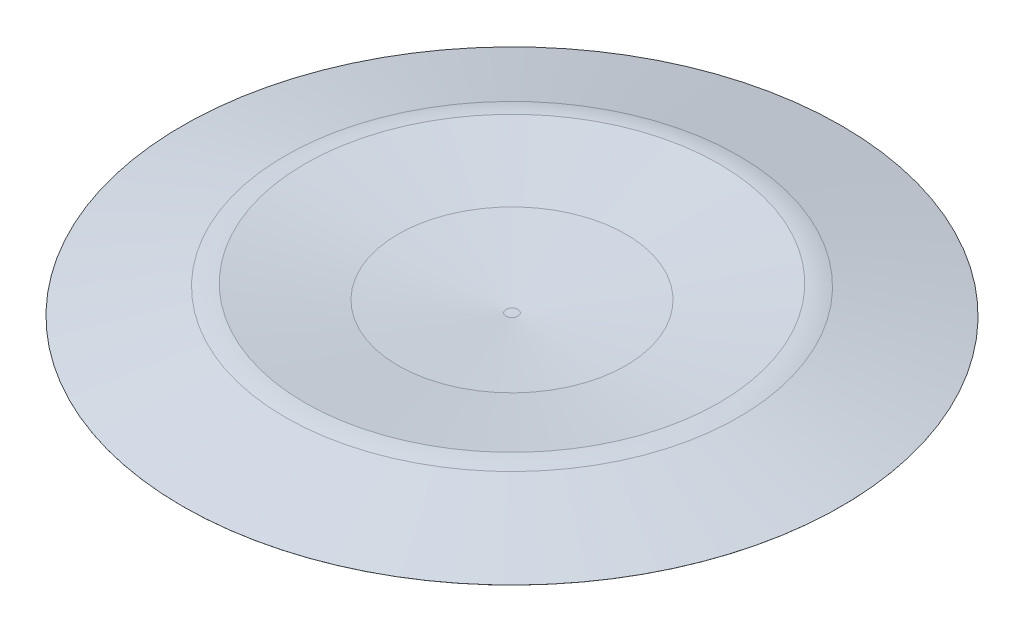
ISO-10303-21;
HEADER;
FILE_DESCRIPTION(('STEP AP214'),'2;1');
FILE_NAME('part.step','',(''),(''),'','','');
FILE_SCHEMA(('AUTOMOTIVE_DESIGN { 1 0 10303 214 1 1 1 1 }'));
ENDSEC;
DATA;
#1=APPLICATION_CONTEXT('core data for automotive mechanical design processes');
#2=APPLICATION_PROTOCOL_DEFINITION('international standard','automotive_design',2000,#1);
#3=PRODUCT_CONTEXT('',#1,'mechanical');
#4=PRODUCT('Part','Part','',(#3));
#5=PRODUCT_RELATED_PRODUCT_CATEGORY('part','',(#4));
#6=PRODUCT_DEFINITION_FORMATION('','',#4);
#7=PRODUCT_DEFINITION_CONTEXT('part definition',#1,'design');
#8=PRODUCT_DEFINITION('design','',#6,#7);
#9=PRODUCT_DEFINITION_SHAPE('','',#8);
#10=(LENGTH_UNIT() NAMED_UNIT(*) SI_UNIT(.MILLI.,.METRE.));
#11=(NAMED_UNIT(*) PLANE_ANGLE_UNIT() SI_UNIT($,.RADIAN.));
#12=(NAMED_UNIT(*) SI_UNIT($,.STERADIAN.) SOLID_ANGLE_UNIT());
#13=UNCERTAINTY_MEASURE_WITH_UNIT(LENGTH_MEASURE(1.E-05),#10,'distance_accuracy_value','');
#14=(GEOMETRIC_REPRESENTATION_CONTEXT(3) GLOBAL_UNCERTAINTY_ASSIGNED_CONTEXT((#13)) GLOBAL_UNIT_ASSIGNED_CONTEXT((#10,
#11,#12)) REPRESENTATION_CONTEXT('',''));
#15=CARTESIAN_POINT('',(0.,0.,0.));
#16=DIRECTION('',(0.,0.,1.));
#17=DIRECTION('',(1.,0.,0.));
#18=AXIS2_PLACEMENT_3D('',#15,#16,#17);
#19=CARTESIAN_POINT('',(-4.84248431704501,544.755446128668,0.));
#20=DIRECTION('',(0.,1.,0.));
#21=DIRECTION('',(0.,0.,1.));
#22=AXIS2_PLACEMENT_3D('',#19,#20,#21);
#23=CONICAL_SURFACE('',#22,559.536973656049,0.243308138618988);
#24=CARTESIAN_POINT('',(-4.84248431704501,544.852500759468,0.));
#25=DIRECTION('',(0.,-1.,0.));
#26=DIRECTION('',(0.,0.,-1.));
#27=AXIS2_PLACEMENT_3D('',#24,#25,#26);
#28=CIRCLE('',#27,559.561065120104);
#29=CARTESIAN_POINT('',(-4.84248431704501,544.852500759468,-559.561065120104));
#30=VERTEX_POINT('',#29);
#31=EDGE_CURVE('E10',#30,#30,#28,.T.);
#32=ORIENTED_EDGE('',*,*,#31,.T.);
#33=EDGE_LOOP('',(#32));
#34=FACE_BOUND('',#33,.T.);
#35=CARTESIAN_POINT('',(-4.84248431704501,544.755446128668,0.));
#36=DIRECTION('',(0.,-1.,0.));
#37=DIRECTION('',(0.,0.,-1.));
#38=AXIS2_PLACEMENT_3D('',#35,#36,#37);
#39=CIRCLE('',#38,559.536973656049);
#40=CARTESIAN_POINT('',(-4.84248431704501,544.755446128668,-559.536973656049));
#41=VERTEX_POINT('',#40);
#42=EDGE_CURVE('E65',#41,#41,#39,.T.);
#43=ORIENTED_EDGE('',*,*,#42,.F.);
#44=EDGE_LOOP('',(#43));
#45=FACE_BOUND('',#44,.T.);
#46=ADVANCED_FACE('F31',(#34,#45),#23,.T.);
#47=CARTESIAN_POINT('',(-4.84248431704501,544.852500759468,0.));
#48=DIRECTION('',(0.,-1.,0.));
#49=DIRECTION('',(0.,0.,-1.));
#50=AXIS2_PLACEMENT_3D('',#47,#48,#49);
#51=CONICAL_SURFACE('',#50,559.561065120104,1.32748818817591);
#52=CARTESIAN_POINT('',(-4.84248431704501,588.217230765257,0.));
#53=DIRECTION('',(0.,-1.,0.));
#54=DIRECTION('',(0.,0.,-1.));
#55=AXIS2_PLACEMENT_3D('',#52,#53,#54);
#56=CIRCLE('',#55,384.862348146623);
#57=CARTESIAN_POINT('',(-4.84248431704501,588.217230765257,-384.862348146623));
#58=VERTEX_POINT('',#57);
#59=EDGE_CURVE('E37',#58,#58,#56,.T.);
#60=ORIENTED_EDGE('',*,*,#59,.T.);
#61=EDGE_LOOP('',(#60));
#62=FACE_BOUND('',#61,.T.);
#63=ORIENTED_EDGE('',*,*,#31,.F.);
#64=EDGE_LOOP('',(#63));
#65=FACE_BOUND('',#64,.T.);
#66=ADVANCED_FACE('F73',(#62,#65),#51,.T.);
#67=CARTESIAN_POINT('',(-4.84248431704504,440.820618816827,0.));
#68=DIRECTION('',(0.,-1.,0.));
#69=DIRECTION('',(0.,0.,-1.));
#70=AXIS2_PLACEMENT_3D('',#67,#68,#69);
#71=TOROIDAL_SURFACE('',#70,347.33037795954,152.1);
#72=CARTESIAN_POINT('',(-4.84248431704501,592.862620368192,0.));
#73=DIRECTION('',(0.,-1.,0.));
#74=DIRECTION('',(0.,0.,-1.));
#75=AXIS2_PLACEMENT_3D('',#72,#73,#74);
#76=CIRCLE('',#75,351.530349894534);
#77=CARTESIAN_POINT('',(-4.84248431704501,592.862620368192,-351.530349894534));
#78=VERTEX_POINT('',#77);
#79=EDGE_CURVE('E41',#78,#78,#76,.T.);
#80=ORIENTED_EDGE('',*,*,#79,.T.);
#81=EDGE_LOOP('',(#80));
#82=FACE_BOUND('',#81,.T.);
#83=ORIENTED_EDGE('',*,*,#59,.F.);
#84=EDGE_LOOP('',(#83));
#85=FACE_BOUND('',#84,.T.);
#86=ADVANCED_FACE('F77',(#82,#85),#71,.T.);
#87=CARTESIAN_POINT('',(-4.84248431704501,592.862620368192,0.));
#88=DIRECTION('',(0.,1.,0.));
#89=DIRECTION('',(0.,0.,1.));
#90=AXIS2_PLACEMENT_3D('',#87,#88,#89);
#91=CONICAL_SURFACE('',#90,351.530349894534,1.41797592265982);
#92=CARTESIAN_POINT('',(-4.84248431704501,568.505419815115,0.));
#93=DIRECTION('',(0.,-1.,0.));
#94=DIRECTION('',(0.,0.,-1.));
#95=AXIS2_PLACEMENT_3D('',#92,#93,#94);
#96=CIRCLE('',#95,193.388565675141);
#97=CARTESIAN_POINT('',(-4.84248431704501,568.505419815115,193.388565675142));
#98=VERTEX_POINT('',#97);
#99=EDGE_CURVE('E45',#98,#98,#96,.T.);
#100=ORIENTED_EDGE('',*,*,#99,.T.);
#101=EDGE_LOOP('',(#100));
#102=FACE_BOUND('',#101,.T.);
#103=ORIENTED_EDGE('',*,*,#79,.F.);
#104=EDGE_LOOP('',(#103));
#105=FACE_BOUND('',#104,.T.);
#106=ADVANCED_FACE('F81',(#102,#105),#91,.F.);
#107=CARTESIAN_POINT('',(-4.84248431704501,568.505419815115,0.));
#108=DIRECTION('',(0.,1.,0.));
#109=DIRECTION('',(0.,0.,1.));
#110=AXIS2_PLACEMENT_3D('',#107,#108,#109);
#111=CONICAL_SURFACE('',#110,193.388565675141,1.46785561534456);
#112=CARTESIAN_POINT('',(-4.84248431704501,549.558479610497,0.));
#113=DIRECTION('',(0.,-1.,0.));
#114=DIRECTION('',(0.,0.,-1.));
#115=AXIS2_PLACEMENT_3D('',#112,#113,#114);
#116=CIRCLE('',#115,9.98234059215341);
#117=CARTESIAN_POINT('',(-4.84248431704501,549.558479610497,9.98234059215394));
#118=VERTEX_POINT('',#117);
#119=EDGE_CURVE('E50',#118,#118,#116,.T.);
#120=CARTESIAN_POINT('',(-4.84248431704501,549.558479610497,9.98234059215394));
#121=CARTESIAN_POINT('',(-4.84248431704501,549.755843570962,11.8928221034351));
#122=CARTESIAN_POINT('',(-4.84248431704501,549.953207531427,13.8033036147162));
#123=CARTESIAN_POINT('',(-4.84248431704501,550.347935452356,17.6242666372784));
#124=CARTESIAN_POINT('',(-4.84248431704501,550.545299412821,19.5347481485596));
#125=CARTESIAN_POINT('',(-4.84248431704501,550.940027333751,23.3557111711218));
#126=CARTESIAN_POINT('',(-4.84248431704501,551.137391294215,25.2661926824029));
#127=CARTESIAN_POINT('',(-4.84248431704501,551.532119215145,29.0871557049652));
#128=CARTESIAN_POINT('',(-4.84248431704501,551.72948317561,30.9976372162463));
#129=CARTESIAN_POINT('',(-4.84248431704501,552.124211096539,34.8186002388085));
#130=CARTESIAN_POINT('',(-4.84248431704501,552.321575057004,36.7290817500897));
#131=CARTESIAN_POINT('',(-4.84248431704501,552.716302977934,40.5500447726519));
#132=CARTESIAN_POINT('',(-4.84248431704501,552.913666938398,42.460526283933));
#133=CARTESIAN_POINT('',(-4.84248431704501,553.308394859328,46.2814893064953));
#134=CARTESIAN_POINT('',(-4.84248431704501,553.505758819793,48.1919708177764));
#135=CARTESIAN_POINT('',(-4.84248431704501,553.900486740722,52.0129338403387));
#136=CARTESIAN_POINT('',(-4.84248431704501,554.097850701187,53.9234153516198));
#137=CARTESIAN_POINT('',(-4.84248431704501,554.492578622117,57.744378374182));
#138=CARTESIAN_POINT('',(-4.84248431704501,554.689942582581,59.6548598854632));
#139=CARTESIAN_POINT('',(-4.84248431704501,555.084670503511,63.4758229080254));
#140=CARTESIAN_POINT('',(-4.84248431704501,555.282034463975,65.3863044193065));
#141=CARTESIAN_POINT('',(-4.84248431704501,555.676762384905,69.2072674418688));
#142=CARTESIAN_POINT('',(-4.84248431704501,555.87412634537,71.1177489531499));
#143=CARTESIAN_POINT('',(-4.84248431704501,556.268854266299,74.9387119757121));
#144=CARTESIAN_POINT('',(-4.84248431704501,556.466218226764,76.8491934869933));
#145=CARTESIAN_POINT('',(-4.84248431704501,556.860946147694,80.6701565095555));
#146=CARTESIAN_POINT('',(-4.84248431704501,557.058310108158,82.5806380208366));
#147=CARTESIAN_POINT('',(-4.84248431704501,557.453038029088,86.4016010433989));
#148=CARTESIAN_POINT('',(-4.84248431704501,557.650401989553,88.31208255468));
#149=CARTESIAN_POINT('',(-4.84248431704501,558.045129910482,92.1330455772423));
#150=CARTESIAN_POINT('',(-4.84248431704501,558.242493870947,94.0435270885234));
#151=CARTESIAN_POINT('',(-4.84248431704501,558.637221791877,97.8644901110856));
#152=CARTESIAN_POINT('',(-4.84248431704501,558.834585752341,99.7749716223668));
#153=CARTESIAN_POINT('',(-4.84248431704501,559.229313673271,103.595934644929));
#154=CARTESIAN_POINT('',(-4.84248431704501,559.426677633735,105.50641615621));
#155=CARTESIAN_POINT('',(-4.84248431704501,559.821405554665,109.327379178772));
#156=CARTESIAN_POINT('',(-4.84248431704501,560.01876951513,111.237860690054));
#157=CARTESIAN_POINT('',(-4.84248431704501,560.413497436059,115.058823712616));
#158=CARTESIAN_POINT('',(-4.84248431704501,560.610861396524,116.969305223897));
#159=CARTESIAN_POINT('',(-4.84248431704501,561.005589317454,120.790268246459));
#160=CARTESIAN_POINT('',(-4.84248431704501,561.202953277918,122.70074975774));
#161=CARTESIAN_POINT('',(-4.84248431704501,561.597681198848,126.521712780302));
#162=CARTESIAN_POINT('',(-4.84248431704501,561.795045159313,128.432194291584));
#163=CARTESIAN_POINT('',(-4.84248431704501,562.189773080242,132.253157314146));
#164=CARTESIAN_POINT('',(-4.84248431704501,562.387137040707,134.163638825427));
#165=CARTESIAN_POINT('',(-4.84248431704501,562.781864961637,137.984601847989));
#166=CARTESIAN_POINT('',(-4.84248431704501,562.979228922101,139.89508335927));
#167=CARTESIAN_POINT('',(-4.84248431704501,563.373956843031,143.716046381833));
#168=CARTESIAN_POINT('',(-4.84248431704501,563.571320803496,145.626527893114));
#169=CARTESIAN_POINT('',(-4.84248431704501,563.966048724425,149.447490915676));
#170=CARTESIAN_POINT('',(-4.84248431704501,564.16341268489,151.357972426957));
#171=CARTESIAN_POINT('',(-4.84248431704501,564.558140605819,155.178935449519));
#172=CARTESIAN_POINT('',(-4.84248431704501,564.755504566284,157.0894169608));
#173=CARTESIAN_POINT('',(-4.84248431704501,565.150232487214,160.910379983363));
#174=CARTESIAN_POINT('',(-4.84248431704501,565.347596447678,162.820861494644));
#175=CARTESIAN_POINT('',(-4.84248431704501,565.742324368608,166.641824517206));
#176=CARTESIAN_POINT('',(-4.84248431704501,565.939688329073,168.552306028487));
#177=CARTESIAN_POINT('',(-4.84248431704501,566.334416250002,172.373269051049));
#178=CARTESIAN_POINT('',(-4.84248431704501,566.531780210467,174.283750562331));
#179=CARTESIAN_POINT('',(-4.84248431704501,566.926508131397,178.104713584893));
#180=CARTESIAN_POINT('',(-4.84248431704501,567.123872091861,180.015195096174));
#181=CARTESIAN_POINT('',(-4.84248431704501,567.518600012791,183.836158118736));
#182=CARTESIAN_POINT('',(-4.84248431704501,567.715963973256,185.746639630017));
#183=CARTESIAN_POINT('',(-4.84248431704501,568.110691894185,189.56760265258));
#184=CARTESIAN_POINT('',(-4.84248431704501,568.30805585465,191.478084163861));
#185=CARTESIAN_POINT('',(-4.84248431704501,568.505419815115,193.388565675142));
#186=B_SPLINE_CURVE_WITH_KNOTS('',3,(#120,#121,#122,#123,#124,#125,#126,#127,#128,#129,#130,
#131,#132,#133,#134,#135,#136,#137,#138,#139,#140,#141,#142,#143,#144,#145,#146,#147,#148,#149,
#150,#151,#152,#153,#154,#155,#156,#157,#158,#159,#160,#161,#162,#163,#164,#165,#166,#167,#168,
#169,#170,#171,#172,#173,#174,#175,#176,#177,#178,#179,#180,#181,#182,#183,#184,#185),
.UNSPECIFIED.,.F.,.F.,(4,2,2,2,2,2,2,2,2,2,2,2,2,2,2,2,2,2,2,2,2,2,2,2,2,2,2,2,2,2,2,2,4),(0.,
5.76194665373917,11.5238933074784,17.2858399612175,23.0477866149567,28.8097332686959,
34.5716799224351,40.3336265761743,46.0955732299134,51.8575198836526,57.6194665373918,
63.3814131911309,69.1433598448701,74.9053064986093,80.6672531523485,86.4291998060876,
92.1911464598268,97.953093113566,103.715039767305,109.476986421044,115.238933074784,
121.000879728523,126.762826382262,132.524773036001,138.28671968974,144.048666343479,
149.810612997219,155.572559650958,161.334506304697,167.096452958436,172.858399612175,
178.620346265914,184.382292919654),.UNSPECIFIED.);
#187=EDGE_CURVE('BSEAM88',#118,#98,#186,.T.);
#188=ORIENTED_EDGE('',*,*,#119,.T.);
#189=ORIENTED_EDGE('',*,*,#99,.F.);
#190=ORIENTED_EDGE('',*,*,#187,.T.);
#191=ORIENTED_EDGE('',*,*,#187,.F.);
#192=EDGE_LOOP('',(#188,#190,#189,#191));
#193=FACE_BOUND('',#192,.T.);
#194=ADVANCED_FACE('F88',(#193),#111,.F.);
#195=CARTESIAN_POINT('',(5.1398562751084,549.558479610497,0.));
#196=DIRECTION('',(0.,1.,0.));
#197=DIRECTION('',(0.,0.,1.));
#198=AXIS2_PLACEMENT_3D('',#195,#196,#197);
#199=PLANE('',#198);
#200=ORIENTED_EDGE('',*,*,#119,.F.);
#201=EDGE_LOOP('',(#200));
#202=FACE_BOUND('',#201,.T.);
#203=ADVANCED_FACE('F92',(#202),#199,.T.);
#204=CARTESIAN_POINT('',(5.14500786067405,549.458479610497,0.));
#205=DIRECTION('',(0.,-1.,0.));
#206=DIRECTION('',(0.,0.,-1.));
#207=AXIS2_PLACEMENT_3D('',#204,#205,#206);
#208=PLANE('',#207);
#209=CARTESIAN_POINT('',(-4.84248431704501,549.458479610497,0.));
#210=DIRECTION('',(0.,-1.,0.));
#211=DIRECTION('',(0.,0.,-1.));
#212=AXIS2_PLACEMENT_3D('',#209,#210,#211);
#213=CIRCLE('',#212,9.98749217771906);
#214=CARTESIAN_POINT('',(-4.84248431704501,549.458479610497,9.9874921777196));
#215=VERTEX_POINT('',#214);
#216=EDGE_CURVE('E53',#215,#215,#213,.T.);
#217=ORIENTED_EDGE('',*,*,#216,.T.);
#218=EDGE_LOOP('',(#217));
#219=FACE_BOUND('',#218,.T.);
#220=ADVANCED_FACE('F96',(#219),#208,.T.);
#221=CARTESIAN_POINT('',(-4.84248431704501,549.458479610497,0.));
#222=DIRECTION('',(0.,1.,0.));
#223=DIRECTION('',(0.,0.,1.));
#224=AXIS2_PLACEMENT_3D('',#221,#222,#223);
#225=CONICAL_SURFACE('',#224,9.98749217771906,1.46785561534456);
#226=CARTESIAN_POINT('',(-4.84248431704501,568.406205519418,0.));
#227=DIRECTION('',(0.,-1.,0.));
#228=DIRECTION('',(0.,0.,-1.));
#229=AXIS2_PLACEMENT_3D('',#226,#227,#228);
#230=CIRCLE('',#229,193.401322871888);
#231=CARTESIAN_POINT('',(-4.84248431704501,568.406205519418,193.401322871889));
#232=VERTEX_POINT('',#231);
#233=EDGE_CURVE('E56',#232,#232,#230,.T.);
#234=CARTESIAN_POINT('',(-4.84248431704501,568.406205519418,193.401322871889));
#235=CARTESIAN_POINT('',(-4.84248431704501,568.208833374533,191.490762135491));
#236=CARTESIAN_POINT('',(-4.84248431704501,568.011461229649,189.580201399093));
#237=CARTESIAN_POINT('',(-4.84248431704501,567.61671693988,185.759079926298));
#238=CARTESIAN_POINT('',(-4.84248431704501,567.419344794995,183.848519189901));
#239=CARTESIAN_POINT('',(-4.84248431704501,567.024600505226,180.027397717105));
#240=CARTESIAN_POINT('',(-4.84248431704501,566.827228360341,178.116836980708));
#241=CARTESIAN_POINT('',(-4.84248431704501,566.432484070572,174.295715507913));
#242=CARTESIAN_POINT('',(-4.84248431704501,566.235111925687,172.385154771515));
#243=CARTESIAN_POINT('',(-4.84248431704501,565.840367635918,168.56403329872));
#244=CARTESIAN_POINT('',(-4.84248431704501,565.642995491034,166.653472562322));
#245=CARTESIAN_POINT('',(-4.84248431704501,565.248251201265,162.832351089527));
#246=CARTESIAN_POINT('',(-4.84248431704501,565.05087905638,160.921790353129));
#247=CARTESIAN_POINT('',(-4.84248431704501,564.656134766611,157.100668880334));
#248=CARTESIAN_POINT('',(-4.84248431704501,564.458762621726,155.190108143937));
#249=CARTESIAN_POINT('',(-4.84248431704501,564.064018331957,151.368986671142));
#250=CARTESIAN_POINT('',(-4.84248431704501,563.866646187072,149.458425934744));
#251=CARTESIAN_POINT('',(-4.84248431704501,563.471901897303,145.637304461949));
#252=CARTESIAN_POINT('',(-4.84248431704501,563.274529752419,143.726743725551));
#253=CARTESIAN_POINT('',(-4.84248431704501,562.879785462649,139.905622252756));
#254=CARTESIAN_POINT('',(-4.84248431704501,562.682413317765,137.995061516358));
#255=CARTESIAN_POINT('',(-4.84248431704501,562.287669027996,134.173940043563));
#256=CARTESIAN_POINT('',(-4.84248431704501,562.090296883111,132.263379307166));
#257=CARTESIAN_POINT('',(-4.84248431704501,561.695552593342,128.44225783437));
#258=CARTESIAN_POINT('',(-4.84248431704501,561.498180448457,126.531697097973));
#259=CARTESIAN_POINT('',(-4.84248431704501,561.103436158688,122.710575625178));
#260=CARTESIAN_POINT('',(-4.84248431704501,560.906064013804,120.80001488878));
#261=CARTESIAN_POINT('',(-4.84248431704501,560.511319724034,116.978893415985));
#262=CARTESIAN_POINT('',(-4.84248431704501,560.31394757915,115.068332679587));
#263=CARTESIAN_POINT('',(-4.84248431704501,559.919203289381,111.247211206792));
#264=CARTESIAN_POINT('',(-4.84248431704501,559.721831144496,109.336650470394));
#265=CARTESIAN_POINT('',(-4.84248431704501,559.327086854727,105.515528997599));
#266=CARTESIAN_POINT('',(-4.84248431704501,559.129714709842,103.604968261202));
#267=CARTESIAN_POINT('',(-4.84248431704501,558.734970420073,99.7838467884065));
#268=CARTESIAN_POINT('',(-4.84248431704501,558.537598275188,97.8732860520089));
#269=CARTESIAN_POINT('',(-4.84248431704501,558.142853985419,94.0521645792137));
#270=CARTESIAN_POINT('',(-4.84248431704501,557.945481840535,92.1416038428161));
#271=CARTESIAN_POINT('',(-4.84248431704501,557.550737550766,88.320482370021));
#272=CARTESIAN_POINT('',(-4.84248431704501,557.353365405881,86.4099216336234));
#273=CARTESIAN_POINT('',(-4.84248431704501,556.958621116112,82.5888001608282));
#274=CARTESIAN_POINT('',(-4.84248431704501,556.761248971227,80.6782394244306));
#275=CARTESIAN_POINT('',(-4.84248431704501,556.366504681458,76.8571179516354));
#276=CARTESIAN_POINT('',(-4.84248431704501,556.169132536573,74.9465572152378));
#277=CARTESIAN_POINT('',(-4.84248431704501,555.774388246804,71.1254357424426));
#278=CARTESIAN_POINT('',(-4.84248431704501,555.57701610192,69.214875006045));
#279=CARTESIAN_POINT('',(-4.84248431704501,555.18227181215,65.3937535332498));
#280=CARTESIAN_POINT('',(-4.84248431704501,554.984899667266,63.4831927968522));
#281=CARTESIAN_POINT('',(-4.84248431704501,554.590155377497,59.662071324057));
#282=CARTESIAN_POINT('',(-4.84248431704501,554.392783232612,57.7515105876594));
#283=CARTESIAN_POINT('',(-4.84248431704501,553.998038942843,53.9303891148643));
#284=CARTESIAN_POINT('',(-4.84248431704501,553.800666797958,52.0198283784667));
#285=CARTESIAN_POINT('',(-4.84248431704501,553.405922508189,48.1987069056715));
#286=CARTESIAN_POINT('',(-4.84248431704501,553.208550363305,46.2881461692739));
#287=CARTESIAN_POINT('',(-4.84248431704501,552.813806073535,42.4670246964787));
#288=CARTESIAN_POINT('',(-4.84248431704501,552.616433928651,40.5564639600811));
#289=CARTESIAN_POINT('',(-4.84248431704501,552.221689638882,36.7353424872859));
#290=CARTESIAN_POINT('',(-4.84248431704501,552.024317493997,34.8247817508883));
#291=CARTESIAN_POINT('',(-4.84248431704501,551.629573204228,31.0036602780931));
#292=CARTESIAN_POINT('',(-4.84248431704501,551.432201059343,29.0930995416955));
#293=CARTESIAN_POINT('',(-4.84248431704501,551.037456769574,25.2719780689004));
#294=CARTESIAN_POINT('',(-4.84248431704501,550.840084624689,23.3614173325028));
#295=CARTESIAN_POINT('',(-4.84248431704501,550.44534033492,19.5402958597076));
#296=CARTESIAN_POINT('',(-4.84248431704501,550.247968190036,17.62973512331));
#297=CARTESIAN_POINT('',(-4.84248431704501,549.853223900267,13.8086136505148));
#298=CARTESIAN_POINT('',(-4.84248431704501,549.655851755382,11.8980529141172));
#299=CARTESIAN_POINT('',(-4.84248431704501,549.458479610497,9.9874921777196));
#300=B_SPLINE_CURVE_WITH_KNOTS('',3,(#234,#235,#236,#237,#238,#239,#240,#241,#242,#243,#244,
#245,#246,#247,#248,#249,#250,#251,#252,#253,#254,#255,#256,#257,#258,#259,#260,#261,#262,#263,
#264,#265,#266,#267,#268,#269,#270,#271,#272,#273,#274,#275,#276,#277,#278,#279,#280,#281,#282,
#283,#284,#285,#286,#287,#288,#289,#290,#291,#292,#293,#294,#295,#296,#297,#298,#299),
.UNSPECIFIED.,.F.,.F.,(4,2,2,2,2,2,2,2,2,2,2,2,2,2,2,2,2,2,2,2,2,2,2,2,2,2,2,2,2,2,2,2,4),(0.,
5.76218559397076,11.5243711879415,17.2865567819122,23.048742375883,28.8109279698538,
34.5731135638245,40.3352991577953,46.0974847517661,51.8596703457368,57.6218559397076,
63.3840415336783,69.1462271276491,74.9084127216198,80.6705983155906,86.4327839095614,
92.1949695035321,97.9571550975029,103.719340691474,109.481526285444,115.243711879415,
121.005897473386,126.768083067357,132.530268661327,138.292454255298,144.054639849269,
149.81682544324,155.57901103721,161.341196631181,167.103382225152,172.865567819123,
178.627753413094,184.389939007064),.UNSPECIFIED.);
#301=EDGE_CURVE('BSEAM100',#232,#215,#300,.T.);
#302=ORIENTED_EDGE('',*,*,#233,.T.);
#303=ORIENTED_EDGE('',*,*,#216,.F.);
#304=ORIENTED_EDGE('',*,*,#301,.T.);
#305=ORIENTED_EDGE('',*,*,#301,.F.);
#306=EDGE_LOOP('',(#302,#304,#303,#305));
#307=FACE_BOUND('',#306,.T.);
#308=ADVANCED_FACE('F100',(#307),#225,.T.);
#309=CARTESIAN_POINT('',(-4.84248431704501,568.406205519418,0.));
#310=DIRECTION('',(0.,1.,0.));
#311=DIRECTION('',(0.,0.,1.));
#312=AXIS2_PLACEMENT_3D('',#309,#310,#311);
#313=CONICAL_SURFACE('',#312,193.401322871888,1.41797592265982);
#314=CARTESIAN_POINT('',(-4.84248431704501,592.762408470999,0.));
#315=DIRECTION('',(0.,-1.,0.));
#316=DIRECTION('',(0.,0.,-1.));
#317=AXIS2_PLACEMENT_3D('',#314,#315,#316);
#318=CIRCLE('',#317,351.536630054634);
#319=CARTESIAN_POINT('',(-4.84248431704501,592.762408470999,-351.536630054634));
#320=VERTEX_POINT('',#319);
#321=EDGE_CURVE('E59',#320,#320,#318,.T.);
#322=ORIENTED_EDGE('',*,*,#321,.T.);
#323=EDGE_LOOP('',(#322));
#324=FACE_BOUND('',#323,.T.);
#325=ORIENTED_EDGE('',*,*,#233,.F.);
#326=EDGE_LOOP('',(#325));
#327=FACE_BOUND('',#326,.T.);
#328=ADVANCED_FACE('F104',(#324,#327),#313,.T.);
#329=CARTESIAN_POINT('',(-4.84248431704504,440.820618816827,0.));
#330=DIRECTION('',(0.,-1.,0.));
#331=DIRECTION('',(0.,0.,-1.));
#332=AXIS2_PLACEMENT_3D('',#329,#330,#331);
#333=TOROIDAL_SURFACE('',#332,347.33037795954,152.);
#334=CARTESIAN_POINT('',(-4.84248431704501,588.120248731363,0.));
#335=DIRECTION('',(0.,-1.,0.));
#336=DIRECTION('',(0.,0.,-1.));
#337=AXIS2_PLACEMENT_3D('',#334,#335,#336);
#338=CIRCLE('',#337,384.837964219401);
#339=CARTESIAN_POINT('',(-4.84248431704501,588.120248731363,-384.837964219401));
#340=VERTEX_POINT('',#339);
#341=EDGE_CURVE('E62',#340,#340,#338,.T.);
#342=ORIENTED_EDGE('',*,*,#341,.T.);
#343=EDGE_LOOP('',(#342));
#344=FACE_BOUND('',#343,.T.);
#345=ORIENTED_EDGE('',*,*,#321,.F.);
#346=EDGE_LOOP('',(#345));
#347=FACE_BOUND('',#346,.T.);
#348=ADVANCED_FACE('F108',(#344,#347),#333,.F.);
#349=CARTESIAN_POINT('',(-4.84248431704501,588.120248731363,0.));
#350=DIRECTION('',(0.,-1.,0.));
#351=DIRECTION('',(0.,0.,-1.));
#352=AXIS2_PLACEMENT_3D('',#349,#350,#351);
#353=CONICAL_SURFACE('',#352,384.837964219401,1.32748818817591);
#354=ORIENTED_EDGE('',*,*,#42,.T.);
#355=EDGE_LOOP('',(#354));
#356=FACE_BOUND('',#355,.T.);
#357=ORIENTED_EDGE('',*,*,#341,.F.);
#358=EDGE_LOOP('',(#357));
#359=FACE_BOUND('',#358,.T.);
#360=ADVANCED_FACE('F69',(#356,#359),#353,.F.);
#361=CLOSED_SHELL('',(#46,#66,#86,#106,#194,#203,#220,#308,#328,#348,#360));
#362=MANIFOLD_SOLID_BREP('B2',#361);
#363=ADVANCED_BREP_SHAPE_REPRESENTATION('',(#18,#362),#14);
#364=SHAPE_DEFINITION_REPRESENTATION(#9,#363);
ENDSEC;
END-ISO-10303-21;
